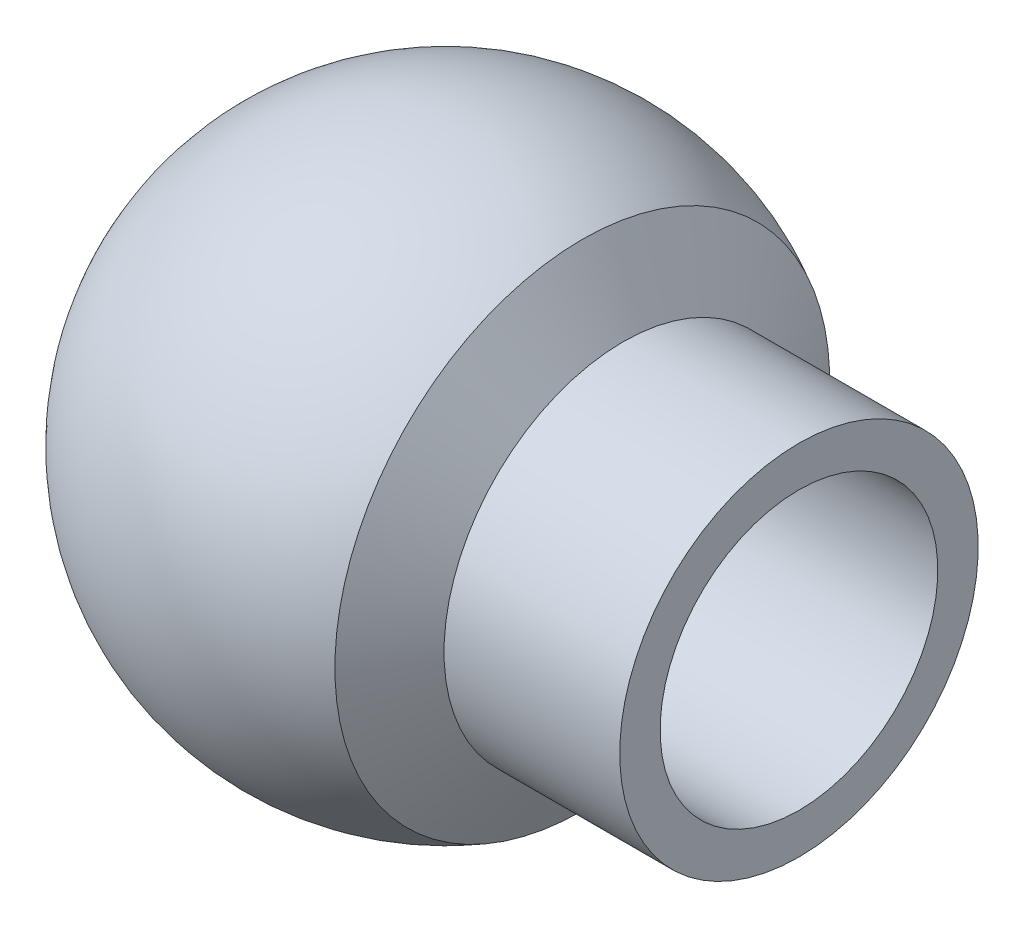
ISO-10303-21;
HEADER;
FILE_DESCRIPTION(('STEP AP214'),'2;1');
FILE_NAME('part.step','',(''),(''),'','','');
FILE_SCHEMA(('AUTOMOTIVE_DESIGN { 1 0 10303 214 1 1 1 1 }'));
ENDSEC;
DATA;
#1=APPLICATION_CONTEXT('core data for automotive mechanical design processes');
#2=APPLICATION_PROTOCOL_DEFINITION('international standard','automotive_design',2000,#1);
#3=PRODUCT_CONTEXT('',#1,'mechanical');
#4=PRODUCT('Part','Part','',(#3));
#5=PRODUCT_RELATED_PRODUCT_CATEGORY('part','',(#4));
#6=PRODUCT_DEFINITION_FORMATION('','',#4);
#7=PRODUCT_DEFINITION_CONTEXT('part definition',#1,'design');
#8=PRODUCT_DEFINITION('design','',#6,#7);
#9=PRODUCT_DEFINITION_SHAPE('','',#8);
#10=(LENGTH_UNIT() NAMED_UNIT(*) SI_UNIT(.MILLI.,.METRE.));
#11=(NAMED_UNIT(*) PLANE_ANGLE_UNIT() SI_UNIT($,.RADIAN.));
#12=(NAMED_UNIT(*) SI_UNIT($,.STERADIAN.) SOLID_ANGLE_UNIT());
#13=UNCERTAINTY_MEASURE_WITH_UNIT(LENGTH_MEASURE(1.E-05),#10,'distance_accuracy_value','');
#14=(GEOMETRIC_REPRESENTATION_CONTEXT(3) GLOBAL_UNCERTAINTY_ASSIGNED_CONTEXT((#13)) GLOBAL_UNIT_ASSIGNED_CONTEXT((#10,
#11,#12)) REPRESENTATION_CONTEXT('',''));
#15=CARTESIAN_POINT('',(0.,0.,0.));
#16=DIRECTION('',(0.,0.,1.));
#17=DIRECTION('',(1.,0.,0.));
#18=AXIS2_PLACEMENT_3D('',#15,#16,#17);
#19=CARTESIAN_POINT('',(-20.,-4.86997616615593,0.));
#20=DIRECTION('',(1.,0.,0.));
#21=DIRECTION('',(0.,1.,0.));
#22=AXIS2_PLACEMENT_3D('',#19,#20,#21);
#23=CYLINDRICAL_SURFACE('',#22,8.875);
#24=CARTESIAN_POINT('',(-8.7,-4.86997616615593,0.));
#25=DIRECTION('',(1.,0.,0.));
#26=DIRECTION('',(0.,1.,0.));
#27=AXIS2_PLACEMENT_3D('',#24,#25,#26);
#28=CIRCLE('',#27,8.875);
#29=CARTESIAN_POINT('',(-8.7,4.00502383384407,0.));
#30=VERTEX_POINT('',#29);
#31=EDGE_CURVE('E10',#30,#30,#28,.T.);
#32=ORIENTED_EDGE('',*,*,#31,.T.);
#33=EDGE_LOOP('',(#32));
#34=FACE_BOUND('',#33,.T.);
#35=CARTESIAN_POINT('',(0.,-4.86997616615593,0.));
#36=DIRECTION('',(1.,0.,0.));
#37=DIRECTION('',(0.,1.,0.));
#38=AXIS2_PLACEMENT_3D('',#35,#36,#37);
#39=CIRCLE('',#38,8.87499999999999);
#40=CARTESIAN_POINT('',(0.,4.00502383384407,0.));
#41=VERTEX_POINT('',#40);
#42=EDGE_CURVE('E52',#41,#41,#39,.T.);
#43=ORIENTED_EDGE('',*,*,#42,.F.);
#44=EDGE_LOOP('',(#43));
#45=FACE_BOUND('',#44,.T.);
#46=ADVANCED_FACE('F33',(#34,#45),#23,.T.);
#47=CARTESIAN_POINT('',(-8.7,-4.86997616615593,0.));
#48=DIRECTION('',(-1.,0.,0.));
#49=DIRECTION('',(0.,-1.,0.));
#50=AXIS2_PLACEMENT_3D('',#47,#48,#49);
#51=CONICAL_SURFACE('',#50,8.875,1.03037682652431);
#52=CARTESIAN_POINT('',(-10.7263513048876,-4.86997616615593,0.));
#53=DIRECTION('',(1.,0.,0.));
#54=DIRECTION('',(0.,1.,0.));
#55=AXIS2_PLACEMENT_3D('',#52,#53,#54);
#56=CIRCLE('',#55,12.2522521748127);
#57=CARTESIAN_POINT('',(-10.7263513048876,7.38227600865676,0.));
#58=VERTEX_POINT('',#57);
#59=EDGE_CURVE('E39',#58,#58,#56,.T.);
#60=ORIENTED_EDGE('',*,*,#59,.T.);
#61=EDGE_LOOP('',(#60));
#62=FACE_BOUND('',#61,.T.);
#63=ORIENTED_EDGE('',*,*,#31,.F.);
#64=EDGE_LOOP('',(#63));
#65=FACE_BOUND('',#64,.T.);
#66=ADVANCED_FACE('F60',(#62,#65),#51,.T.);
#67=CARTESIAN_POINT('',(-17.5,-4.86997616615594,0.));
#68=DIRECTION('',(1.,0.,0.));
#69=DIRECTION('',(0.,1.,0.));
#70=AXIS2_PLACEMENT_3D('',#67,#68,#69);
#71=SPHERICAL_SURFACE('',#70,14.);
#72=ORIENTED_EDGE('',*,*,#59,.F.);
#73=EDGE_LOOP('',(#72));
#74=FACE_BOUND('',#73,.T.);
#75=ADVANCED_FACE('F64',(#74),#71,.T.);
#76=CARTESIAN_POINT('',(-20.,2.00502383384406,0.));
#77=DIRECTION('',(1.,0.,0.));
#78=DIRECTION('',(0.,1.,0.));
#79=AXIS2_PLACEMENT_3D('',#76,#77,#78);
#80=PLANE('',#79);
#81=CARTESIAN_POINT('',(-20.,-4.86997616615593,0.));
#82=DIRECTION('',(1.,0.,0.));
#83=DIRECTION('',(0.,1.,0.));
#84=AXIS2_PLACEMENT_3D('',#81,#82,#83);
#85=CIRCLE('',#84,6.875);
#86=CARTESIAN_POINT('',(-20.,2.00502383384406,0.));
#87=VERTEX_POINT('',#86);
#88=EDGE_CURVE('E43',#87,#87,#85,.T.);
#89=ORIENTED_EDGE('',*,*,#88,.T.);
#90=EDGE_LOOP('',(#89));
#91=FACE_BOUND('',#90,.T.);
#92=ADVANCED_FACE('F68',(#91),#80,.T.);
#93=CARTESIAN_POINT('',(-20.,-4.86997616615593,0.));
#94=DIRECTION('',(1.,0.,0.));
#95=DIRECTION('',(0.,1.,0.));
#96=AXIS2_PLACEMENT_3D('',#93,#94,#95);
#97=CYLINDRICAL_SURFACE('',#96,6.875);
#98=CARTESIAN_POINT('',(0.,-4.86997616615593,0.));
#99=DIRECTION('',(1.,0.,0.));
#100=DIRECTION('',(0.,1.,0.));
#101=AXIS2_PLACEMENT_3D('',#98,#99,#100);
#102=CIRCLE('',#101,6.87499999999999);
#103=CARTESIAN_POINT('',(0.,2.00502383384406,0.));
#104=VERTEX_POINT('',#103);
#105=EDGE_CURVE('E47',#104,#104,#102,.T.);
#106=ORIENTED_EDGE('',*,*,#105,.T.);
#107=EDGE_LOOP('',(#106));
#108=FACE_BOUND('',#107,.T.);
#109=ORIENTED_EDGE('',*,*,#88,.F.);
#110=EDGE_LOOP('',(#109));
#111=FACE_BOUND('',#110,.T.);
#112=ADVANCED_FACE('F75',(#108,#111),#97,.F.);
#113=CARTESIAN_POINT('',(0.,4.00502383384406,0.));
#114=DIRECTION('',(1.,0.,0.));
#115=DIRECTION('',(0.,1.,0.));
#116=AXIS2_PLACEMENT_3D('',#113,#114,#115);
#117=PLANE('',#116);
#118=ORIENTED_EDGE('',*,*,#42,.T.);
#119=EDGE_LOOP('',(#118));
#120=FACE_BOUND('',#119,.T.);
#121=ORIENTED_EDGE('',*,*,#105,.F.);
#122=EDGE_LOOP('',(#121));
#123=FACE_BOUND('',#122,.T.);
#124=ADVANCED_FACE('F56',(#120,#123),#117,.T.);
#125=CLOSED_SHELL('',(#46,#66,#75,#92,#112,#124));
#126=MANIFOLD_SOLID_BREP('B2',#125);
#127=ADVANCED_BREP_SHAPE_REPRESENTATION('',(#18,#126),#14);
#128=SHAPE_DEFINITION_REPRESENTATION(#9,#127);
ENDSEC;
END-ISO-10303-21;
